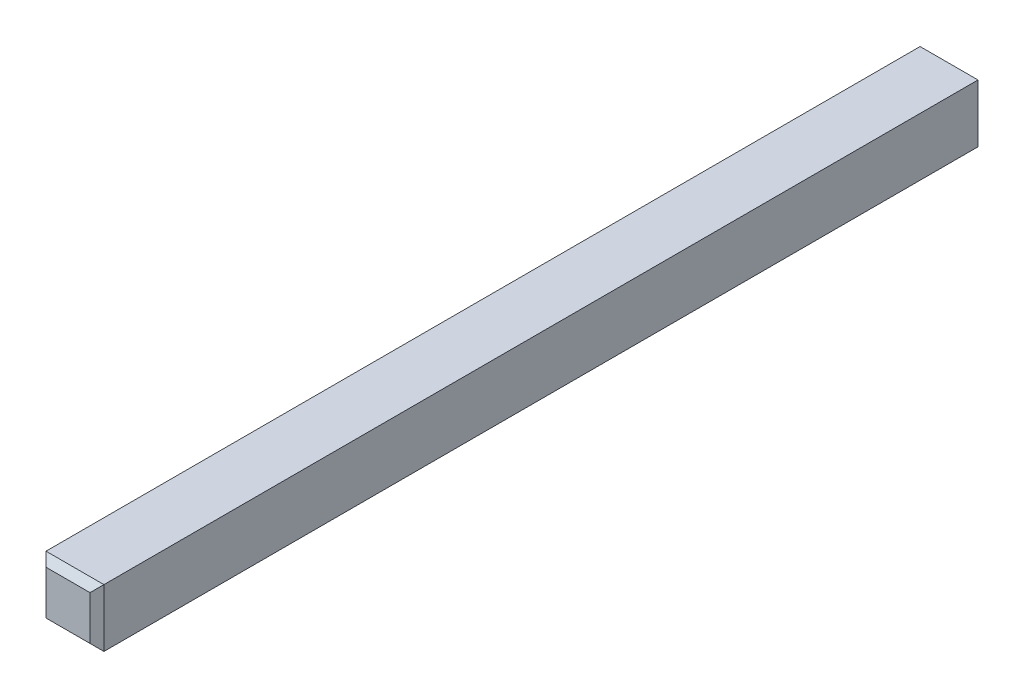
ISO-10303-21;
HEADER;
FILE_DESCRIPTION(('STEP AP214'),'2;1');
FILE_NAME('part.step','',(''),(''),'','','');
FILE_SCHEMA(('AUTOMOTIVE_DESIGN { 1 0 10303 214 1 1 1 1 }'));
ENDSEC;
DATA;
#1=APPLICATION_CONTEXT('core data for automotive mechanical design processes');
#2=APPLICATION_PROTOCOL_DEFINITION('international standard','automotive_design',2000,#1);
#3=PRODUCT_CONTEXT('',#1,'mechanical');
#4=PRODUCT('Part','Part','',(#3));
#5=PRODUCT_RELATED_PRODUCT_CATEGORY('part','',(#4));
#6=PRODUCT_DEFINITION_FORMATION('','',#4);
#7=PRODUCT_DEFINITION_CONTEXT('part definition',#1,'design');
#8=PRODUCT_DEFINITION('design','',#6,#7);
#9=PRODUCT_DEFINITION_SHAPE('','',#8);
#10=(LENGTH_UNIT() NAMED_UNIT(*) SI_UNIT(.MILLI.,.METRE.));
#11=(NAMED_UNIT(*) PLANE_ANGLE_UNIT() SI_UNIT($,.RADIAN.));
#12=(NAMED_UNIT(*) SI_UNIT($,.STERADIAN.) SOLID_ANGLE_UNIT());
#13=UNCERTAINTY_MEASURE_WITH_UNIT(LENGTH_MEASURE(1.E-05),#10,'distance_accuracy_value','');
#14=(GEOMETRIC_REPRESENTATION_CONTEXT(3) GLOBAL_UNCERTAINTY_ASSIGNED_CONTEXT((#13)) GLOBAL_UNIT_ASSIGNED_CONTEXT((#10,
#11,#12)) REPRESENTATION_CONTEXT('',''));
#15=CARTESIAN_POINT('',(0.,0.,0.));
#16=DIRECTION('',(0.,0.,1.));
#17=DIRECTION('',(1.,0.,0.));
#18=AXIS2_PLACEMENT_3D('',#15,#16,#17);
#19=CARTESIAN_POINT('',(0.,0.,11.5));
#20=DIRECTION('',(1.,0.,0.));
#21=DIRECTION('',(0.,1.,0.));
#22=AXIS2_PLACEMENT_3D('',#19,#20,#21);
#23=PLANE('',#22);
#24=DIRECTION('',(0.,0.,-1.));
#25=VECTOR('',#24,1.);
#26=CARTESIAN_POINT('',(0.,0.75,11.5));
#27=LINE('',#26,#25);
#28=CARTESIAN_POINT('',(0.,0.75,11.41));
#29=VERTEX_POINT('',#28);
#30=CARTESIAN_POINT('',(0.,0.75,0.0899999999999998));
#31=VERTEX_POINT('',#30);
#32=EDGE_CURVE('E159',#29,#31,#27,.T.);
#33=ORIENTED_EDGE('',*,*,#32,.T.);
#34=DIRECTION('',(0.,-1.,0.));
#35=VECTOR('',#34,1.);
#36=CARTESIAN_POINT('',(0.,0.,0.0899999999999998));
#37=LINE('',#36,#35);
#38=CARTESIAN_POINT('',(0.,0.,0.0899999999999998));
#39=VERTEX_POINT('',#38);
#40=EDGE_CURVE('E187',#31,#39,#37,.T.);
#41=ORIENTED_EDGE('',*,*,#40,.T.);
#42=DIRECTION('',(0.,0.,-1.));
#43=VECTOR('',#42,1.);
#44=CARTESIAN_POINT('',(0.,0.,11.5));
#45=LINE('',#44,#43);
#46=CARTESIAN_POINT('',(0.,0.,11.41));
#47=VERTEX_POINT('',#46);
#48=EDGE_CURVE('E128',#47,#39,#45,.T.);
#49=ORIENTED_EDGE('',*,*,#48,.F.);
#50=DIRECTION('',(0.,1.,0.));
#51=VECTOR('',#50,1.);
#52=CARTESIAN_POINT('',(0.,0.,11.41));
#53=LINE('',#52,#51);
#54=EDGE_CURVE('E185',#47,#29,#53,.T.);
#55=ORIENTED_EDGE('',*,*,#54,.T.);
#56=EDGE_LOOP('',(#33,#41,#49,#55));
#57=FACE_BOUND('',#56,.T.);
#58=ADVANCED_FACE('F36',(#57),#23,.F.);
#59=CARTESIAN_POINT('',(0.,0.,11.5));
#60=DIRECTION('',(0.,1.,0.));
#61=DIRECTION('',(0.,0.,1.));
#62=AXIS2_PLACEMENT_3D('',#59,#60,#61);
#63=PLANE('',#62);
#64=ORIENTED_EDGE('',*,*,#48,.T.);
#65=DIRECTION('',(1.,0.,0.));
#66=VECTOR('',#65,1.);
#67=CARTESIAN_POINT('',(0.75,0.,0.0899999999999998));
#68=LINE('',#67,#66);
#69=CARTESIAN_POINT('',(0.75,0.,0.0899999999999998));
#70=VERTEX_POINT('',#69);
#71=EDGE_CURVE('E127',#39,#70,#68,.T.);
#72=ORIENTED_EDGE('',*,*,#71,.T.);
#73=DIRECTION('',(0.,0.,-1.));
#74=VECTOR('',#73,1.);
#75=CARTESIAN_POINT('',(0.75,0.,11.5));
#76=LINE('',#75,#74);
#77=CARTESIAN_POINT('',(0.75,0.,11.41));
#78=VERTEX_POINT('',#77);
#79=EDGE_CURVE('E110',#78,#70,#76,.T.);
#80=ORIENTED_EDGE('',*,*,#79,.F.);
#81=DIRECTION('',(-1.,0.,0.));
#82=VECTOR('',#81,1.);
#83=CARTESIAN_POINT('',(0.,0.,11.41));
#84=LINE('',#83,#82);
#85=EDGE_CURVE('E124',#78,#47,#84,.T.);
#86=ORIENTED_EDGE('',*,*,#85,.T.);
#87=EDGE_LOOP('',(#64,#72,#80,#86));
#88=FACE_BOUND('',#87,.T.);
#89=ADVANCED_FACE('F123',(#88),#63,.F.);
#90=CARTESIAN_POINT('',(0.75,0.,11.5));
#91=DIRECTION('',(-1.,0.,0.));
#92=DIRECTION('',(0.,-1.,0.));
#93=AXIS2_PLACEMENT_3D('',#90,#91,#92);
#94=PLANE('',#93);
#95=ORIENTED_EDGE('',*,*,#79,.T.);
#96=DIRECTION('',(0.,1.,0.));
#97=VECTOR('',#96,1.);
#98=CARTESIAN_POINT('',(0.75,0.75,0.0899999999999998));
#99=LINE('',#98,#97);
#100=CARTESIAN_POINT('',(0.75,0.75,0.0899999999999998));
#101=VERTEX_POINT('',#100);
#102=EDGE_CURVE('E116',#70,#101,#99,.T.);
#103=ORIENTED_EDGE('',*,*,#102,.T.);
#104=DIRECTION('',(0.,0.,-1.));
#105=VECTOR('',#104,1.);
#106=CARTESIAN_POINT('',(0.75,0.75,11.5));
#107=LINE('',#106,#105);
#108=CARTESIAN_POINT('',(0.75,0.75,11.41));
#109=VERTEX_POINT('',#108);
#110=EDGE_CURVE('E112',#109,#101,#107,.T.);
#111=ORIENTED_EDGE('',*,*,#110,.F.);
#112=DIRECTION('',(0.,-1.,0.));
#113=VECTOR('',#112,1.);
#114=CARTESIAN_POINT('',(0.75,0.,11.41));
#115=LINE('',#114,#113);
#116=EDGE_CURVE('E107',#109,#78,#115,.T.);
#117=ORIENTED_EDGE('',*,*,#116,.T.);
#118=EDGE_LOOP('',(#95,#103,#111,#117));
#119=FACE_BOUND('',#118,.T.);
#120=ADVANCED_FACE('F109',(#119),#94,.F.);
#121=CARTESIAN_POINT('',(0.,0.75,11.5));
#122=DIRECTION('',(0.,-1.,0.));
#123=DIRECTION('',(0.,0.,-1.));
#124=AXIS2_PLACEMENT_3D('',#121,#122,#123);
#125=PLANE('',#124);
#126=ORIENTED_EDGE('',*,*,#110,.T.);
#127=DIRECTION('',(-1.,0.,0.));
#128=VECTOR('',#127,1.);
#129=CARTESIAN_POINT('',(0.,0.75,0.0899999999999998));
#130=LINE('',#129,#128);
#131=EDGE_CURVE('E183',#101,#31,#130,.T.);
#132=ORIENTED_EDGE('',*,*,#131,.T.);
#133=ORIENTED_EDGE('',*,*,#32,.F.);
#134=DIRECTION('',(1.,0.,0.));
#135=VECTOR('',#134,1.);
#136=CARTESIAN_POINT('',(0.,0.75,11.41));
#137=LINE('',#136,#135);
#138=EDGE_CURVE('E181',#29,#109,#137,.T.);
#139=ORIENTED_EDGE('',*,*,#138,.T.);
#140=EDGE_LOOP('',(#126,#132,#133,#139));
#141=FACE_BOUND('',#140,.T.);
#142=ADVANCED_FACE('F197',(#141),#125,.F.);
#143=CARTESIAN_POINT('',(0.,0.,11.5));
#144=DIRECTION('',(0.,0.,-1.));
#145=DIRECTION('',(-1.,0.,0.));
#146=AXIS2_PLACEMENT_3D('',#143,#144,#145);
#147=PLANE('',#146);
#148=DIRECTION('',(0.,-1.,0.));
#149=VECTOR('',#148,1.);
#150=CARTESIAN_POINT('',(0.0900000000000015,0.,11.5));
#151=LINE('',#150,#149);
#152=CARTESIAN_POINT('',(0.0900000000000013,0.659999999999998,11.5));
#153=VERTEX_POINT('',#152);
#154=CARTESIAN_POINT('',(0.0900000000000015,0.0900000000000015,11.5));
#155=VERTEX_POINT('',#154);
#156=EDGE_CURVE('E61',#153,#155,#151,.T.);
#157=ORIENTED_EDGE('',*,*,#156,.T.);
#158=DIRECTION('',(1.,0.,0.));
#159=VECTOR('',#158,1.);
#160=CARTESIAN_POINT('',(0.,0.0900000000000015,11.5));
#161=LINE('',#160,#159);
#162=CARTESIAN_POINT('',(0.659999999999998,0.0900000000000015,11.5));
#163=VERTEX_POINT('',#162);
#164=EDGE_CURVE('E11',#155,#163,#161,.T.);
#165=ORIENTED_EDGE('',*,*,#164,.T.);
#166=DIRECTION('',(0.,1.,0.));
#167=VECTOR('',#166,1.);
#168=CARTESIAN_POINT('',(0.659999999999998,0.,11.5));
#169=LINE('',#168,#167);
#170=CARTESIAN_POINT('',(0.659999999999998,0.659999999999998,11.5));
#171=VERTEX_POINT('',#170);
#172=EDGE_CURVE('E46',#163,#171,#169,.T.);
#173=ORIENTED_EDGE('',*,*,#172,.T.);
#174=DIRECTION('',(-1.,0.,0.));
#175=VECTOR('',#174,1.);
#176=CARTESIAN_POINT('',(0.,0.659999999999998,11.5));
#177=LINE('',#176,#175);
#178=EDGE_CURVE('E189',#171,#153,#177,.T.);
#179=ORIENTED_EDGE('',*,*,#178,.T.);
#180=EDGE_LOOP('',(#157,#165,#173,#179));
#181=FACE_BOUND('',#180,.T.);
#182=ADVANCED_FACE('F192',(#181),#147,.F.);
#183=CARTESIAN_POINT('',(0.,0.,0.));
#184=DIRECTION('',(0.,0.,-1.));
#185=DIRECTION('',(-1.,0.,0.));
#186=AXIS2_PLACEMENT_3D('',#183,#184,#185);
#187=PLANE('',#186);
#188=DIRECTION('',(0.,-1.,0.));
#189=VECTOR('',#188,1.);
#190=CARTESIAN_POINT('',(0.66,0.,0.));
#191=LINE('',#190,#189);
#192=CARTESIAN_POINT('',(0.66,0.66,0.));
#193=VERTEX_POINT('',#192);
#194=CARTESIAN_POINT('',(0.66,0.0899999999999998,0.));
#195=VERTEX_POINT('',#194);
#196=EDGE_CURVE('E176',#193,#195,#191,.T.);
#197=ORIENTED_EDGE('',*,*,#196,.T.);
#198=DIRECTION('',(-1.,0.,0.));
#199=VECTOR('',#198,1.);
#200=CARTESIAN_POINT('',(0.,0.0899999999999998,0.));
#201=LINE('',#200,#199);
#202=CARTESIAN_POINT('',(0.0899999999999998,0.0899999999999998,0.));
#203=VERTEX_POINT('',#202);
#204=EDGE_CURVE('E117',#195,#203,#201,.T.);
#205=ORIENTED_EDGE('',*,*,#204,.T.);
#206=DIRECTION('',(0.,1.,0.));
#207=VECTOR('',#206,1.);
#208=CARTESIAN_POINT('',(0.0899999999999996,0.75,0.));
#209=LINE('',#208,#207);
#210=CARTESIAN_POINT('',(0.0899999999999996,0.66,0.));
#211=VERTEX_POINT('',#210);
#212=EDGE_CURVE('E172',#203,#211,#209,.T.);
#213=ORIENTED_EDGE('',*,*,#212,.T.);
#214=DIRECTION('',(1.,0.,0.));
#215=VECTOR('',#214,1.);
#216=CARTESIAN_POINT('',(0.75,0.66,0.));
#217=LINE('',#216,#215);
#218=EDGE_CURVE('E174',#211,#193,#217,.T.);
#219=ORIENTED_EDGE('',*,*,#218,.T.);
#220=EDGE_LOOP('',(#197,#205,#213,#219));
#221=FACE_BOUND('',#220,.T.);
#222=ADVANCED_FACE('F225',(#221),#187,.T.);
#223=CARTESIAN_POINT('',(0.,0.75,0.0899999999999998));
#224=DIRECTION('',(0.,0.707106781186548,-0.707106781186548));
#225=DIRECTION('',(1.,0.,0.));
#226=AXIS2_PLACEMENT_3D('',#223,#224,#225);
#227=PLANE('',#226);
#228=DIRECTION('',(-0.577350269189626,-0.577350269189626,-0.577350269189626));
#229=VECTOR('',#228,1.);
#230=CARTESIAN_POINT('',(0.5,0.5,-0.16));
#231=LINE('',#230,#229);
#232=EDGE_CURVE('E151',#193,#101,#231,.F.);
#233=ORIENTED_EDGE('',*,*,#232,.F.);
#234=ORIENTED_EDGE('',*,*,#218,.F.);
#235=DIRECTION('',(0.577350269189626,-0.577350269189626,-0.577350269189626));
#236=VECTOR('',#235,1.);
#237=CARTESIAN_POINT('',(0.25,0.5,-0.16));
#238=LINE('',#237,#236);
#239=EDGE_CURVE('E139',#31,#211,#238,.T.);
#240=ORIENTED_EDGE('',*,*,#239,.F.);
#241=ORIENTED_EDGE('',*,*,#131,.F.);
#242=EDGE_LOOP('',(#233,#234,#240,#241));
#243=FACE_BOUND('',#242,.T.);
#244=ADVANCED_FACE('F200',(#243),#227,.T.);
#245=CARTESIAN_POINT('',(0.,0.,0.0899999999999998));
#246=DIRECTION('',(-0.707106781186548,0.,-0.707106781186548));
#247=DIRECTION('',(0.,1.,0.));
#248=AXIS2_PLACEMENT_3D('',#245,#246,#247);
#249=PLANE('',#248);
#250=ORIENTED_EDGE('',*,*,#239,.T.);
#251=ORIENTED_EDGE('',*,*,#212,.F.);
#252=DIRECTION('',(-0.577350269189626,-0.577350269189626,0.577350269189626));
#253=VECTOR('',#252,1.);
#254=CARTESIAN_POINT('',(0.,0.,0.0899999999999998));
#255=LINE('',#254,#253);
#256=EDGE_CURVE('E145',#39,#203,#255,.F.);
#257=ORIENTED_EDGE('',*,*,#256,.F.);
#258=ORIENTED_EDGE('',*,*,#40,.F.);
#259=EDGE_LOOP('',(#250,#251,#257,#258));
#260=FACE_BOUND('',#259,.T.);
#261=ADVANCED_FACE('F203',(#260),#249,.T.);
#262=CARTESIAN_POINT('',(0.75,0.,0.0899999999999998));
#263=DIRECTION('',(0.707106781186548,0.,-0.707106781186548));
#264=DIRECTION('',(0.,-1.,0.));
#265=AXIS2_PLACEMENT_3D('',#262,#263,#264);
#266=PLANE('',#265);
#267=ORIENTED_EDGE('',*,*,#232,.T.);
#268=ORIENTED_EDGE('',*,*,#102,.F.);
#269=DIRECTION('',(-0.577350269189626,0.577350269189626,-0.577350269189626));
#270=VECTOR('',#269,1.);
#271=CARTESIAN_POINT('',(0.75,0.,0.0899999999999998));
#272=LINE('',#271,#270);
#273=EDGE_CURVE('E142',#195,#70,#272,.F.);
#274=ORIENTED_EDGE('',*,*,#273,.F.);
#275=ORIENTED_EDGE('',*,*,#196,.F.);
#276=EDGE_LOOP('',(#267,#268,#274,#275));
#277=FACE_BOUND('',#276,.T.);
#278=ADVANCED_FACE('F206',(#277),#266,.T.);
#279=CARTESIAN_POINT('',(0.,0.,0.0899999999999998));
#280=DIRECTION('',(0.,-0.707106781186548,-0.707106781186548));
#281=DIRECTION('',(-1.,0.,0.));
#282=AXIS2_PLACEMENT_3D('',#279,#280,#281);
#283=PLANE('',#282);
#284=ORIENTED_EDGE('',*,*,#256,.T.);
#285=ORIENTED_EDGE('',*,*,#204,.F.);
#286=ORIENTED_EDGE('',*,*,#273,.T.);
#287=ORIENTED_EDGE('',*,*,#71,.F.);
#288=EDGE_LOOP('',(#284,#285,#286,#287));
#289=FACE_BOUND('',#288,.T.);
#290=ADVANCED_FACE('F204',(#289),#283,.T.);
#291=CARTESIAN_POINT('',(0.,0.659999999999998,11.5));
#292=DIRECTION('',(0.,-0.707106781186547,-0.707106781186547));
#293=DIRECTION('',(-1.,0.,0.));
#294=AXIS2_PLACEMENT_3D('',#291,#292,#293);
#295=PLANE('',#294);
#296=DIRECTION('',(0.577350269189626,0.577350269189626,-0.577350269189626));
#297=VECTOR('',#296,1.);
#298=CARTESIAN_POINT('',(0.439999999999999,0.439999999999999,11.72));
#299=LINE('',#298,#297);
#300=EDGE_CURVE('E136',#109,#171,#299,.F.);
#301=ORIENTED_EDGE('',*,*,#300,.F.);
#302=ORIENTED_EDGE('',*,*,#138,.F.);
#303=DIRECTION('',(0.577350269189626,-0.577350269189626,0.577350269189626));
#304=VECTOR('',#303,1.);
#305=CARTESIAN_POINT('',(0.0600000000000009,0.689999999999999,11.47));
#306=LINE('',#305,#304);
#307=EDGE_CURVE('E41',#153,#29,#306,.F.);
#308=ORIENTED_EDGE('',*,*,#307,.F.);
#309=ORIENTED_EDGE('',*,*,#178,.F.);
#310=EDGE_LOOP('',(#301,#302,#308,#309));
#311=FACE_BOUND('',#310,.T.);
#312=ADVANCED_FACE('F39',(#311),#295,.F.);
#313=CARTESIAN_POINT('',(0.0900000000000015,0.,11.5));
#314=DIRECTION('',(0.707106781186547,0.,-0.707106781186547));
#315=DIRECTION('',(0.,-1.,0.));
#316=AXIS2_PLACEMENT_3D('',#313,#314,#315);
#317=PLANE('',#316);
#318=ORIENTED_EDGE('',*,*,#307,.T.);
#319=ORIENTED_EDGE('',*,*,#54,.F.);
#320=DIRECTION('',(0.577350269189626,0.577350269189626,0.577350269189626));
#321=VECTOR('',#320,1.);
#322=CARTESIAN_POINT('',(0.060000000000001,0.060000000000001,11.47));
#323=LINE('',#322,#321);
#324=EDGE_CURVE('E131',#155,#47,#323,.F.);
#325=ORIENTED_EDGE('',*,*,#324,.F.);
#326=ORIENTED_EDGE('',*,*,#156,.F.);
#327=EDGE_LOOP('',(#318,#319,#325,#326));
#328=FACE_BOUND('',#327,.T.);
#329=ADVANCED_FACE('F195',(#328),#317,.F.);
#330=CARTESIAN_POINT('',(0.659999999999998,0.,11.5));
#331=DIRECTION('',(-0.707106781186547,0.,-0.707106781186547));
#332=DIRECTION('',(0.,1.,0.));
#333=AXIS2_PLACEMENT_3D('',#330,#331,#332);
#334=PLANE('',#333);
#335=ORIENTED_EDGE('',*,*,#300,.T.);
#336=ORIENTED_EDGE('',*,*,#172,.F.);
#337=DIRECTION('',(0.577350269189626,-0.577350269189626,-0.577350269189626));
#338=VECTOR('',#337,1.);
#339=CARTESIAN_POINT('',(0.689999999999999,0.0600000000000011,11.47));
#340=LINE('',#339,#338);
#341=EDGE_CURVE('E54',#78,#163,#340,.F.);
#342=ORIENTED_EDGE('',*,*,#341,.F.);
#343=ORIENTED_EDGE('',*,*,#116,.F.);
#344=EDGE_LOOP('',(#335,#336,#342,#343));
#345=FACE_BOUND('',#344,.T.);
#346=ADVANCED_FACE('F134',(#345),#334,.F.);
#347=CARTESIAN_POINT('',(0.,0.0900000000000015,11.5));
#348=DIRECTION('',(0.,0.707106781186547,-0.707106781186547));
#349=DIRECTION('',(1.,0.,0.));
#350=AXIS2_PLACEMENT_3D('',#347,#348,#349);
#351=PLANE('',#350);
#352=ORIENTED_EDGE('',*,*,#324,.T.);
#353=ORIENTED_EDGE('',*,*,#85,.F.);
#354=ORIENTED_EDGE('',*,*,#341,.T.);
#355=ORIENTED_EDGE('',*,*,#164,.F.);
#356=EDGE_LOOP('',(#352,#353,#354,#355));
#357=FACE_BOUND('',#356,.T.);
#358=ADVANCED_FACE('F130',(#357),#351,.F.);
#359=CLOSED_SHELL('',(#58,#89,#120,#142,#182,#222,#244,#261,#278,#290,#312,#329,#346,#358));
#360=MANIFOLD_SOLID_BREP('B2',#359);
#361=ADVANCED_BREP_SHAPE_REPRESENTATION('',(#18,#360),#14);
#362=SHAPE_DEFINITION_REPRESENTATION(#9,#361);
ENDSEC;
END-ISO-10303-21;
